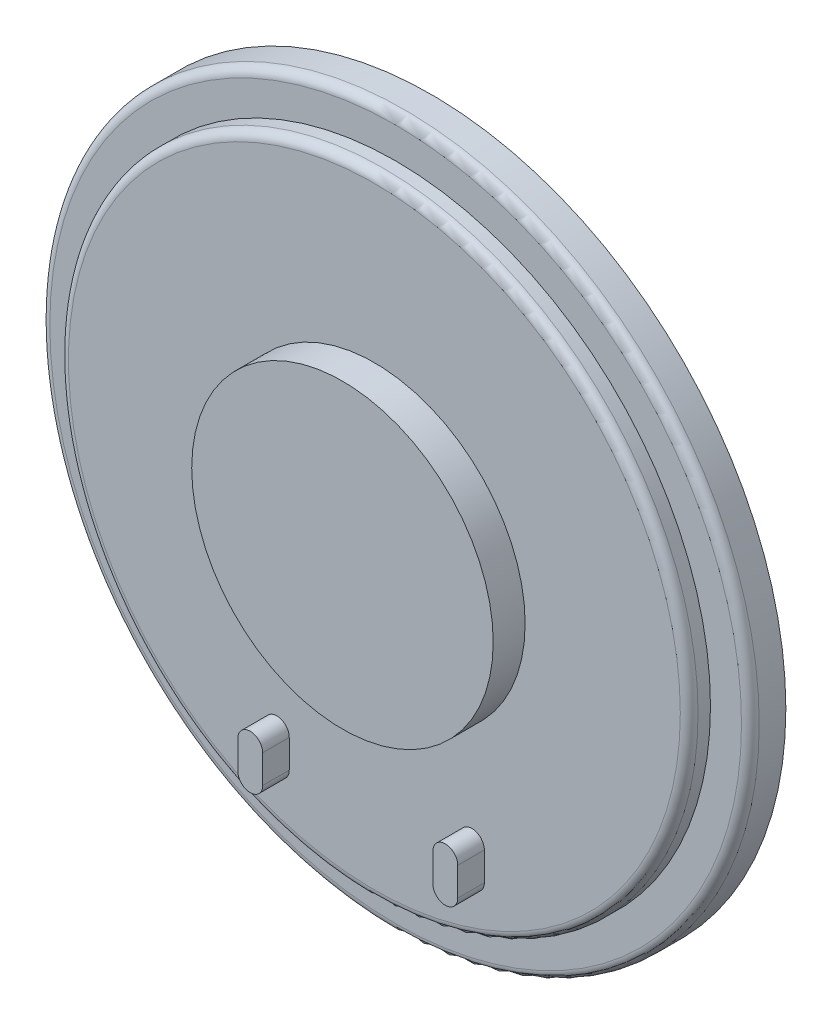
ISO-10303-21;
HEADER;
FILE_DESCRIPTION(('STEP AP214'),'2;1');
FILE_NAME('part.step','',(''),(''),'','','');
FILE_SCHEMA(('AUTOMOTIVE_DESIGN { 1 0 10303 214 1 1 1 1 }'));
ENDSEC;
DATA;
#1=APPLICATION_CONTEXT('core data for automotive mechanical design processes');
#2=APPLICATION_PROTOCOL_DEFINITION('international standard','automotive_design',2000,#1);
#3=PRODUCT_CONTEXT('',#1,'mechanical');
#4=PRODUCT('Part','Part','',(#3));
#5=PRODUCT_RELATED_PRODUCT_CATEGORY('part','',(#4));
#6=PRODUCT_DEFINITION_FORMATION('','',#4);
#7=PRODUCT_DEFINITION_CONTEXT('part definition',#1,'design');
#8=PRODUCT_DEFINITION('design','',#6,#7);
#9=PRODUCT_DEFINITION_SHAPE('','',#8);
#10=(LENGTH_UNIT() NAMED_UNIT(*) SI_UNIT(.MILLI.,.METRE.));
#11=(NAMED_UNIT(*) PLANE_ANGLE_UNIT() SI_UNIT($,.RADIAN.));
#12=(NAMED_UNIT(*) SI_UNIT($,.STERADIAN.) SOLID_ANGLE_UNIT());
#13=UNCERTAINTY_MEASURE_WITH_UNIT(LENGTH_MEASURE(1.E-05),#10,'distance_accuracy_value','');
#14=(GEOMETRIC_REPRESENTATION_CONTEXT(3) GLOBAL_UNCERTAINTY_ASSIGNED_CONTEXT((#13)) GLOBAL_UNIT_ASSIGNED_CONTEXT((#10,
#11,#12)) REPRESENTATION_CONTEXT('',''));
#15=CARTESIAN_POINT('',(0.,0.,0.));
#16=DIRECTION('',(0.,0.,1.));
#17=DIRECTION('',(1.,0.,0.));
#18=AXIS2_PLACEMENT_3D('',#15,#16,#17);
#19=CARTESIAN_POINT('',(0.,0.,3.2));
#20=DIRECTION('',(0.,0.,1.));
#21=DIRECTION('',(1.,0.,0.));
#22=AXIS2_PLACEMENT_3D('',#19,#20,#21);
#23=PLANE('',#22);
#24=DIRECTION('',(0.,-1.,0.));
#25=VECTOR('',#24,1.);
#26=CARTESIAN_POINT('',(-6.2,-12.2,3.2));
#27=LINE('',#26,#25);
#28=CARTESIAN_POINT('',(-6.2,-12.2,3.2));
#29=VERTEX_POINT('',#28);
#30=CARTESIAN_POINT('',(-6.2,-13.8,3.2));
#31=VERTEX_POINT('',#30);
#32=EDGE_CURVE('E133',#29,#31,#27,.T.);
#33=ORIENTED_EDGE('',*,*,#32,.F.);
#34=CARTESIAN_POINT('',(-5.5,-12.2,3.2));
#35=DIRECTION('',(0.,0.,1.));
#36=DIRECTION('',(1.,0.,0.));
#37=AXIS2_PLACEMENT_3D('',#34,#35,#36);
#38=CIRCLE('',#37,0.700000000000001);
#39=CARTESIAN_POINT('',(-4.8,-12.2,3.2));
#40=VERTEX_POINT('',#39);
#41=EDGE_CURVE('E130',#40,#29,#38,.T.);
#42=ORIENTED_EDGE('',*,*,#41,.F.);
#43=DIRECTION('',(0.,1.,0.));
#44=VECTOR('',#43,1.);
#45=CARTESIAN_POINT('',(-4.8,-12.2,3.2));
#46=LINE('',#45,#44);
#47=CARTESIAN_POINT('',(-4.8,-13.8,3.2));
#48=VERTEX_POINT('',#47);
#49=EDGE_CURVE('E142',#48,#40,#46,.T.);
#50=ORIENTED_EDGE('',*,*,#49,.F.);
#51=CARTESIAN_POINT('',(-5.5,-13.8,3.2));
#52=DIRECTION('',(0.,0.,1.));
#53=DIRECTION('',(1.,0.,0.));
#54=AXIS2_PLACEMENT_3D('',#51,#52,#53);
#55=CIRCLE('',#54,0.700000000000001);
#56=EDGE_CURVE('E150',#31,#48,#55,.T.);
#57=ORIENTED_EDGE('',*,*,#56,.F.);
#58=EDGE_LOOP('',(#33,#42,#50,#57));
#59=FACE_BOUND('',#58,.T.);
#60=CARTESIAN_POINT('',(0.,0.,3.2));
#61=DIRECTION('',(0.,0.,1.));
#62=DIRECTION('',(1.,0.,0.));
#63=AXIS2_PLACEMENT_3D('',#60,#61,#62);
#64=CIRCLE('',#63,17.25);
#65=CARTESIAN_POINT('',(17.25,0.,3.2));
#66=VERTEX_POINT('',#65);
#67=EDGE_CURVE('E13',#66,#66,#64,.T.);
#68=ORIENTED_EDGE('',*,*,#67,.T.);
#69=EDGE_LOOP('',(#68));
#70=FACE_BOUND('',#69,.T.);
#71=CARTESIAN_POINT('',(0.,0.,3.2));
#72=DIRECTION('',(0.,0.,1.));
#73=DIRECTION('',(1.,0.,0.));
#74=AXIS2_PLACEMENT_3D('',#71,#72,#73);
#75=CIRCLE('',#74,8.5);
#76=CARTESIAN_POINT('',(8.5,0.,3.2));
#77=VERTEX_POINT('',#76);
#78=EDGE_CURVE('E165',#77,#77,#75,.T.);
#79=ORIENTED_EDGE('',*,*,#78,.F.);
#80=EDGE_LOOP('',(#79));
#81=FACE_BOUND('',#80,.T.);
#82=DIRECTION('',(0.,-1.,0.));
#83=VECTOR('',#82,1.);
#84=CARTESIAN_POINT('',(4.8,-12.2,3.2));
#85=LINE('',#84,#83);
#86=CARTESIAN_POINT('',(4.8,-12.2,3.2));
#87=VERTEX_POINT('',#86);
#88=CARTESIAN_POINT('',(4.8,-13.8,3.2));
#89=VERTEX_POINT('',#88);
#90=EDGE_CURVE('E395',#87,#89,#85,.T.);
#91=ORIENTED_EDGE('',*,*,#90,.F.);
#92=CARTESIAN_POINT('',(5.5,-12.2,3.2));
#93=DIRECTION('',(0.,0.,1.));
#94=DIRECTION('',(-1.,0.,0.));
#95=AXIS2_PLACEMENT_3D('',#92,#93,#94);
#96=CIRCLE('',#95,0.700000000000001);
#97=CARTESIAN_POINT('',(6.2,-12.2,3.2));
#98=VERTEX_POINT('',#97);
#99=EDGE_CURVE('E128',#98,#87,#96,.T.);
#100=ORIENTED_EDGE('',*,*,#99,.F.);
#101=DIRECTION('',(0.,1.,0.));
#102=VECTOR('',#101,1.);
#103=CARTESIAN_POINT('',(6.2,-12.2,3.2));
#104=LINE('',#103,#102);
#105=CARTESIAN_POINT('',(6.2,-13.8,3.2));
#106=VERTEX_POINT('',#105);
#107=EDGE_CURVE('E124',#106,#98,#104,.T.);
#108=ORIENTED_EDGE('',*,*,#107,.F.);
#109=CARTESIAN_POINT('',(5.5,-13.8,3.2));
#110=DIRECTION('',(0.,0.,1.));
#111=DIRECTION('',(-1.,0.,0.));
#112=AXIS2_PLACEMENT_3D('',#109,#110,#111);
#113=CIRCLE('',#112,0.700000000000001);
#114=EDGE_CURVE('E397',#89,#106,#113,.T.);
#115=ORIENTED_EDGE('',*,*,#114,.F.);
#116=EDGE_LOOP('',(#91,#100,#108,#115));
#117=FACE_BOUND('',#116,.T.);
#118=ADVANCED_FACE('F39',(#59,#70,#81,#117),#23,.T.);
#119=CARTESIAN_POINT('',(0.,0.,-57.134227919873));
#120=DIRECTION('',(0.,0.,1.));
#121=DIRECTION('',(1.,0.,0.));
#122=AXIS2_PLACEMENT_3D('',#119,#120,#121);
#123=CYLINDRICAL_SURFACE('',#122,17.75);
#124=CARTESIAN_POINT('',(0.,0.,2.7));
#125=DIRECTION('',(0.,0.,1.));
#126=DIRECTION('',(1.,0.,0.));
#127=AXIS2_PLACEMENT_3D('',#124,#125,#126);
#128=CIRCLE('',#127,17.75);
#129=CARTESIAN_POINT('',(17.75,0.,2.7));
#130=VERTEX_POINT('',#129);
#131=EDGE_CURVE('E47',#130,#130,#128,.F.);
#132=ORIENTED_EDGE('',*,*,#131,.T.);
#133=EDGE_LOOP('',(#132));
#134=FACE_BOUND('',#133,.T.);
#135=CARTESIAN_POINT('',(0.,0.,2.));
#136=DIRECTION('',(0.,0.,1.));
#137=DIRECTION('',(1.,0.,0.));
#138=AXIS2_PLACEMENT_3D('',#135,#136,#137);
#139=CIRCLE('',#138,17.75);
#140=CARTESIAN_POINT('',(17.75,0.,2.));
#141=VERTEX_POINT('',#140);
#142=EDGE_CURVE('E168',#141,#141,#139,.F.);
#143=ORIENTED_EDGE('',*,*,#142,.F.);
#144=EDGE_LOOP('',(#143));
#145=FACE_BOUND('',#144,.T.);
#146=ADVANCED_FACE('F190',(#134,#145),#123,.T.);
#147=CARTESIAN_POINT('',(0.,0.,5.));
#148=DIRECTION('',(0.,0.,-1.));
#149=DIRECTION('',(-1.,0.,0.));
#150=AXIS2_PLACEMENT_3D('',#147,#148,#149);
#151=CYLINDRICAL_SURFACE('',#150,20.);
#152=CARTESIAN_POINT('',(0.,0.,1.5));
#153=DIRECTION('',(0.,0.,1.));
#154=DIRECTION('',(1.,0.,0.));
#155=AXIS2_PLACEMENT_3D('',#152,#153,#154);
#156=CIRCLE('',#155,20.);
#157=CARTESIAN_POINT('',(20.,0.,1.5));
#158=VERTEX_POINT('',#157);
#159=EDGE_CURVE('E185',#158,#158,#156,.F.);
#160=ORIENTED_EDGE('',*,*,#159,.T.);
#161=EDGE_LOOP('',(#160));
#162=FACE_BOUND('',#161,.T.);
#163=CARTESIAN_POINT('',(0.,0.,0.));
#164=DIRECTION('',(0.,0.,1.));
#165=DIRECTION('',(1.,0.,0.));
#166=AXIS2_PLACEMENT_3D('',#163,#164,#165);
#167=CIRCLE('',#166,20.);
#168=CARTESIAN_POINT('',(20.,0.,0.));
#169=VERTEX_POINT('',#168);
#170=EDGE_CURVE('E173',#169,#169,#167,.T.);
#171=ORIENTED_EDGE('',*,*,#170,.T.);
#172=EDGE_LOOP('',(#171));
#173=FACE_BOUND('',#172,.T.);
#174=ADVANCED_FACE('F213',(#162,#173),#151,.T.);
#175=CARTESIAN_POINT('',(0.,0.,0.));
#176=DIRECTION('',(0.,0.,1.));
#177=DIRECTION('',(1.,0.,0.));
#178=AXIS2_PLACEMENT_3D('',#175,#176,#177);
#179=PLANE('',#178);
#180=CARTESIAN_POINT('',(0.,0.,0.));
#181=DIRECTION('',(0.,0.,1.));
#182=DIRECTION('',(1.,0.,0.));
#183=AXIS2_PLACEMENT_3D('',#180,#181,#182);
#184=CIRCLE('',#183,19.25);
#185=CARTESIAN_POINT('',(19.25,0.,0.));
#186=VERTEX_POINT('',#185);
#187=EDGE_CURVE('E179',#186,#186,#184,.T.);
#188=ORIENTED_EDGE('',*,*,#187,.T.);
#189=EDGE_LOOP('',(#188));
#190=FACE_BOUND('',#189,.T.);
#191=ORIENTED_EDGE('',*,*,#170,.F.);
#192=EDGE_LOOP('',(#191));
#193=FACE_BOUND('',#192,.T.);
#194=ADVANCED_FACE('F223',(#190,#193),#179,.F.);
#195=CARTESIAN_POINT('',(0.,0.,2.));
#196=DIRECTION('',(0.,0.,1.));
#197=DIRECTION('',(1.,0.,0.));
#198=AXIS2_PLACEMENT_3D('',#195,#196,#197);
#199=PLANE('',#198);
#200=CARTESIAN_POINT('',(0.,0.,2.));
#201=DIRECTION('',(0.,0.,1.));
#202=DIRECTION('',(1.,0.,0.));
#203=AXIS2_PLACEMENT_3D('',#200,#201,#202);
#204=CIRCLE('',#203,19.5);
#205=CARTESIAN_POINT('',(19.5,0.,2.));
#206=VERTEX_POINT('',#205);
#207=EDGE_CURVE('E182',#206,#206,#204,.T.);
#208=ORIENTED_EDGE('',*,*,#207,.T.);
#209=EDGE_LOOP('',(#208));
#210=FACE_BOUND('',#209,.T.);
#211=ORIENTED_EDGE('',*,*,#142,.T.);
#212=EDGE_LOOP('',(#211));
#213=FACE_BOUND('',#212,.T.);
#214=ADVANCED_FACE('F221',(#210,#213),#199,.T.);
#215=CARTESIAN_POINT('',(0.,0.,3.2));
#216=DIRECTION('',(0.,0.,1.));
#217=DIRECTION('',(1.,0.,0.));
#218=AXIS2_PLACEMENT_3D('',#215,#216,#217);
#219=CYLINDRICAL_SURFACE('',#218,8.5);
#220=ORIENTED_EDGE('',*,*,#78,.T.);
#221=EDGE_LOOP('',(#220));
#222=FACE_BOUND('',#221,.T.);
#223=CARTESIAN_POINT('',(0.,0.,5.));
#224=DIRECTION('',(0.,0.,1.));
#225=DIRECTION('',(1.,0.,0.));
#226=AXIS2_PLACEMENT_3D('',#223,#224,#225);
#227=CIRCLE('',#226,8.5);
#228=CARTESIAN_POINT('',(8.5,0.,5.));
#229=VERTEX_POINT('',#228);
#230=EDGE_CURVE('E164',#229,#229,#227,.T.);
#231=ORIENTED_EDGE('',*,*,#230,.F.);
#232=EDGE_LOOP('',(#231));
#233=FACE_BOUND('',#232,.T.);
#234=ADVANCED_FACE('F219',(#222,#233),#219,.T.);
#235=CARTESIAN_POINT('',(0.,0.,5.));
#236=DIRECTION('',(0.,0.,1.));
#237=DIRECTION('',(1.,0.,0.));
#238=AXIS2_PLACEMENT_3D('',#235,#236,#237);
#239=PLANE('',#238);
#240=ORIENTED_EDGE('',*,*,#230,.T.);
#241=EDGE_LOOP('',(#240));
#242=FACE_BOUND('',#241,.T.);
#243=ADVANCED_FACE('F226',(#242),#239,.T.);
#244=CARTESIAN_POINT('',(0.,0.,1.8));
#245=DIRECTION('',(0.,0.,-1.));
#246=DIRECTION('',(-1.,0.,0.));
#247=AXIS2_PLACEMENT_3D('',#244,#245,#246);
#248=CYLINDRICAL_SURFACE('',#247,17.75);
#249=CARTESIAN_POINT('',(0.,0.,1.5));
#250=DIRECTION('',(0.,0.,1.));
#251=DIRECTION('',(1.,0.,0.));
#252=AXIS2_PLACEMENT_3D('',#249,#250,#251);
#253=CIRCLE('',#252,17.75);
#254=CARTESIAN_POINT('',(17.75,0.,1.5));
#255=VERTEX_POINT('',#254);
#256=EDGE_CURVE('E176',#255,#255,#253,.F.);
#257=ORIENTED_EDGE('',*,*,#256,.T.);
#258=EDGE_LOOP('',(#257));
#259=FACE_BOUND('',#258,.T.);
#260=CARTESIAN_POINT('',(0.,0.,1.8));
#261=DIRECTION('',(0.,0.,-1.));
#262=DIRECTION('',(-1.,0.,0.));
#263=AXIS2_PLACEMENT_3D('',#260,#261,#262);
#264=CIRCLE('',#263,17.75);
#265=CARTESIAN_POINT('',(-17.75,0.,1.8));
#266=VERTEX_POINT('',#265);
#267=EDGE_CURVE('E161',#266,#266,#264,.T.);
#268=ORIENTED_EDGE('',*,*,#267,.F.);
#269=EDGE_LOOP('',(#268));
#270=FACE_BOUND('',#269,.T.);
#271=ADVANCED_FACE('F229',(#259,#270),#248,.F.);
#272=CARTESIAN_POINT('',(0.,0.,1.8));
#273=DIRECTION('',(0.,0.,-1.));
#274=DIRECTION('',(-1.,0.,0.));
#275=AXIS2_PLACEMENT_3D('',#272,#273,#274);
#276=PLANE('',#275);
#277=ORIENTED_EDGE('',*,*,#267,.T.);
#278=EDGE_LOOP('',(#277));
#279=FACE_BOUND('',#278,.T.);
#280=ADVANCED_FACE('F238',(#279),#276,.T.);
#281=CARTESIAN_POINT('',(0.,0.,1.5));
#282=DIRECTION('',(0.,0.,1.));
#283=DIRECTION('',(1.,0.,0.));
#284=AXIS2_PLACEMENT_3D('',#281,#282,#283);
#285=TOROIDAL_SURFACE('',#284,19.25,1.5);
#286=ORIENTED_EDGE('',*,*,#187,.F.);
#287=EDGE_LOOP('',(#286));
#288=FACE_BOUND('',#287,.T.);
#289=ORIENTED_EDGE('',*,*,#256,.F.);
#290=EDGE_LOOP('',(#289));
#291=FACE_BOUND('',#290,.T.);
#292=ADVANCED_FACE('F204',(#288,#291),#285,.T.);
#293=CARTESIAN_POINT('',(0.,0.,1.5));
#294=DIRECTION('',(0.,0.,1.));
#295=DIRECTION('',(1.,0.,0.));
#296=AXIS2_PLACEMENT_3D('',#293,#294,#295);
#297=TOROIDAL_SURFACE('',#296,19.5,0.5);
#298=ORIENTED_EDGE('',*,*,#159,.F.);
#299=EDGE_LOOP('',(#298));
#300=FACE_BOUND('',#299,.T.);
#301=ORIENTED_EDGE('',*,*,#207,.F.);
#302=EDGE_LOOP('',(#301));
#303=FACE_BOUND('',#302,.T.);
#304=ADVANCED_FACE('F195',(#300,#303),#297,.T.);
#305=CARTESIAN_POINT('',(0.,0.,2.7));
#306=DIRECTION('',(0.,0.,1.));
#307=DIRECTION('',(1.,0.,0.));
#308=AXIS2_PLACEMENT_3D('',#305,#306,#307);
#309=TOROIDAL_SURFACE('',#308,17.25,0.5);
#310=ORIENTED_EDGE('',*,*,#67,.F.);
#311=EDGE_LOOP('',(#310));
#312=FACE_BOUND('',#311,.T.);
#313=ORIENTED_EDGE('',*,*,#131,.F.);
#314=EDGE_LOOP('',(#313));
#315=FACE_BOUND('',#314,.T.);
#316=ADVANCED_FACE('F41',(#312,#315),#309,.T.);
#317=CARTESIAN_POINT('',(-5.5,-12.2,4.7));
#318=DIRECTION('',(0.,0.,-1.));
#319=DIRECTION('',(-1.,0.,0.));
#320=AXIS2_PLACEMENT_3D('',#317,#318,#319);
#321=CYLINDRICAL_SURFACE('',#320,0.700000000000001);
#322=ORIENTED_EDGE('',*,*,#41,.T.);
#323=DIRECTION('',(0.,0.,-1.));
#324=VECTOR('',#323,1.);
#325=CARTESIAN_POINT('',(-6.2,-12.2,4.7));
#326=LINE('',#325,#324);
#327=CARTESIAN_POINT('',(-6.2,-12.2,4.7));
#328=VERTEX_POINT('',#327);
#329=EDGE_CURVE('E159',#328,#29,#326,.T.);
#330=ORIENTED_EDGE('',*,*,#329,.F.);
#331=CARTESIAN_POINT('',(-5.5,-12.2,4.7));
#332=DIRECTION('',(0.,0.,1.));
#333=DIRECTION('',(1.,0.,0.));
#334=AXIS2_PLACEMENT_3D('',#331,#332,#333);
#335=CIRCLE('',#334,0.700000000000001);
#336=CARTESIAN_POINT('',(-4.8,-12.2,4.7));
#337=VERTEX_POINT('',#336);
#338=EDGE_CURVE('E138',#337,#328,#335,.T.);
#339=ORIENTED_EDGE('',*,*,#338,.F.);
#340=DIRECTION('',(0.,0.,-1.));
#341=VECTOR('',#340,1.);
#342=CARTESIAN_POINT('',(-4.8,-12.2,4.7));
#343=LINE('',#342,#341);
#344=EDGE_CURVE('E147',#337,#40,#343,.T.);
#345=ORIENTED_EDGE('',*,*,#344,.T.);
#346=EDGE_LOOP('',(#322,#330,#339,#345));
#347=FACE_BOUND('',#346,.T.);
#348=ADVANCED_FACE('F194',(#347),#321,.T.);
#349=CARTESIAN_POINT('',(-6.2,-12.2,4.7));
#350=DIRECTION('',(1.,0.,0.));
#351=DIRECTION('',(0.,0.,-1.));
#352=AXIS2_PLACEMENT_3D('',#349,#350,#351);
#353=PLANE('',#352);
#354=ORIENTED_EDGE('',*,*,#32,.T.);
#355=DIRECTION('',(0.,0.,-1.));
#356=VECTOR('',#355,1.);
#357=CARTESIAN_POINT('',(-6.2,-13.8,4.7));
#358=LINE('',#357,#356);
#359=CARTESIAN_POINT('',(-6.2,-13.8,4.7));
#360=VERTEX_POINT('',#359);
#361=EDGE_CURVE('E156',#360,#31,#358,.T.);
#362=ORIENTED_EDGE('',*,*,#361,.F.);
#363=DIRECTION('',(0.,-1.,0.));
#364=VECTOR('',#363,1.);
#365=CARTESIAN_POINT('',(-6.2,-12.2,4.7));
#366=LINE('',#365,#364);
#367=EDGE_CURVE('E141',#328,#360,#366,.T.);
#368=ORIENTED_EDGE('',*,*,#367,.F.);
#369=ORIENTED_EDGE('',*,*,#329,.T.);
#370=EDGE_LOOP('',(#354,#362,#368,#369));
#371=FACE_BOUND('',#370,.T.);
#372=ADVANCED_FACE('F201',(#371),#353,.F.);
#373=CARTESIAN_POINT('',(-5.5,-13.8,4.7));
#374=DIRECTION('',(0.,0.,-1.));
#375=DIRECTION('',(-1.,0.,0.));
#376=AXIS2_PLACEMENT_3D('',#373,#374,#375);
#377=CYLINDRICAL_SURFACE('',#376,0.700000000000001);
#378=ORIENTED_EDGE('',*,*,#56,.T.);
#379=DIRECTION('',(0.,0.,-1.));
#380=VECTOR('',#379,1.);
#381=CARTESIAN_POINT('',(-4.8,-13.8,4.7));
#382=LINE('',#381,#380);
#383=CARTESIAN_POINT('',(-4.8,-13.8,4.7));
#384=VERTEX_POINT('',#383);
#385=EDGE_CURVE('E62',#384,#48,#382,.T.);
#386=ORIENTED_EDGE('',*,*,#385,.F.);
#387=CARTESIAN_POINT('',(-5.5,-13.8,4.7));
#388=DIRECTION('',(0.,0.,1.));
#389=DIRECTION('',(1.,0.,0.));
#390=AXIS2_PLACEMENT_3D('',#387,#388,#389);
#391=CIRCLE('',#390,0.700000000000001);
#392=EDGE_CURVE('E144',#360,#384,#391,.T.);
#393=ORIENTED_EDGE('',*,*,#392,.F.);
#394=ORIENTED_EDGE('',*,*,#361,.T.);
#395=EDGE_LOOP('',(#378,#386,#393,#394));
#396=FACE_BOUND('',#395,.T.);
#397=ADVANCED_FACE('F257',(#396),#377,.T.);
#398=CARTESIAN_POINT('',(-4.8,-12.2,4.7));
#399=DIRECTION('',(-1.,0.,0.));
#400=DIRECTION('',(0.,0.,1.));
#401=AXIS2_PLACEMENT_3D('',#398,#399,#400);
#402=PLANE('',#401);
#403=ORIENTED_EDGE('',*,*,#49,.T.);
#404=ORIENTED_EDGE('',*,*,#344,.F.);
#405=DIRECTION('',(0.,1.,0.));
#406=VECTOR('',#405,1.);
#407=CARTESIAN_POINT('',(-4.8,-12.2,4.7));
#408=LINE('',#407,#406);
#409=EDGE_CURVE('E146',#384,#337,#408,.T.);
#410=ORIENTED_EDGE('',*,*,#409,.F.);
#411=ORIENTED_EDGE('',*,*,#385,.T.);
#412=EDGE_LOOP('',(#403,#404,#410,#411));
#413=FACE_BOUND('',#412,.T.);
#414=ADVANCED_FACE('F261',(#413),#402,.F.);
#415=CARTESIAN_POINT('',(-5.5,-12.2,4.7));
#416=DIRECTION('',(0.,0.,1.));
#417=DIRECTION('',(1.,0.,0.));
#418=AXIS2_PLACEMENT_3D('',#415,#416,#417);
#419=PLANE('',#418);
#420=ORIENTED_EDGE('',*,*,#338,.T.);
#421=ORIENTED_EDGE('',*,*,#367,.T.);
#422=ORIENTED_EDGE('',*,*,#392,.T.);
#423=ORIENTED_EDGE('',*,*,#409,.T.);
#424=EDGE_LOOP('',(#420,#421,#422,#423));
#425=FACE_BOUND('',#424,.T.);
#426=ADVANCED_FACE('F265',(#425),#419,.T.);
#427=CARTESIAN_POINT('',(5.5,-12.2,4.7));
#428=DIRECTION('',(0.,0.,-1.));
#429=DIRECTION('',(-1.,0.,0.));
#430=AXIS2_PLACEMENT_3D('',#427,#428,#429);
#431=CYLINDRICAL_SURFACE('',#430,0.700000000000001);
#432=ORIENTED_EDGE('',*,*,#99,.T.);
#433=DIRECTION('',(0.,0.,-1.));
#434=VECTOR('',#433,1.);
#435=CARTESIAN_POINT('',(4.8,-12.2,4.7));
#436=LINE('',#435,#434);
#437=CARTESIAN_POINT('',(4.8,-12.2,4.7));
#438=VERTEX_POINT('',#437);
#439=EDGE_CURVE('E109',#438,#87,#436,.T.);
#440=ORIENTED_EDGE('',*,*,#439,.F.);
#441=CARTESIAN_POINT('',(5.5,-12.2,4.7));
#442=DIRECTION('',(0.,0.,1.));
#443=DIRECTION('',(-1.,0.,0.));
#444=AXIS2_PLACEMENT_3D('',#441,#442,#443);
#445=CIRCLE('',#444,0.700000000000001);
#446=CARTESIAN_POINT('',(6.2,-12.2,4.7));
#447=VERTEX_POINT('',#446);
#448=EDGE_CURVE('E116',#447,#438,#445,.T.);
#449=ORIENTED_EDGE('',*,*,#448,.F.);
#450=DIRECTION('',(0.,0.,-1.));
#451=VECTOR('',#450,1.);
#452=CARTESIAN_POINT('',(6.2,-12.2,4.7));
#453=LINE('',#452,#451);
#454=EDGE_CURVE('E404',#447,#98,#453,.T.);
#455=ORIENTED_EDGE('',*,*,#454,.T.);
#456=EDGE_LOOP('',(#432,#440,#449,#455));
#457=FACE_BOUND('',#456,.T.);
#458=ADVANCED_FACE('F126',(#457),#431,.T.);
#459=CARTESIAN_POINT('',(4.8,-12.2,4.7));
#460=DIRECTION('',(1.,0.,0.));
#461=DIRECTION('',(0.,0.,-1.));
#462=AXIS2_PLACEMENT_3D('',#459,#460,#461);
#463=PLANE('',#462);
#464=ORIENTED_EDGE('',*,*,#90,.T.);
#465=DIRECTION('',(0.,0.,-1.));
#466=VECTOR('',#465,1.);
#467=CARTESIAN_POINT('',(4.8,-13.8,4.7));
#468=LINE('',#467,#466);
#469=CARTESIAN_POINT('',(4.8,-13.8,4.7));
#470=VERTEX_POINT('',#469);
#471=EDGE_CURVE('E112',#470,#89,#468,.T.);
#472=ORIENTED_EDGE('',*,*,#471,.F.);
#473=DIRECTION('',(0.,-1.,0.));
#474=VECTOR('',#473,1.);
#475=CARTESIAN_POINT('',(4.8,-12.2,4.7));
#476=LINE('',#475,#474);
#477=EDGE_CURVE('E105',#438,#470,#476,.T.);
#478=ORIENTED_EDGE('',*,*,#477,.F.);
#479=ORIENTED_EDGE('',*,*,#439,.T.);
#480=EDGE_LOOP('',(#464,#472,#478,#479));
#481=FACE_BOUND('',#480,.T.);
#482=ADVANCED_FACE('F107',(#481),#463,.F.);
#483=CARTESIAN_POINT('',(5.5,-13.8,4.7));
#484=DIRECTION('',(0.,0.,-1.));
#485=DIRECTION('',(-1.,0.,0.));
#486=AXIS2_PLACEMENT_3D('',#483,#484,#485);
#487=CYLINDRICAL_SURFACE('',#486,0.700000000000001);
#488=ORIENTED_EDGE('',*,*,#114,.T.);
#489=DIRECTION('',(0.,0.,-1.));
#490=VECTOR('',#489,1.);
#491=CARTESIAN_POINT('',(6.2,-13.8,4.7));
#492=LINE('',#491,#490);
#493=CARTESIAN_POINT('',(6.2,-13.8,4.7));
#494=VERTEX_POINT('',#493);
#495=EDGE_CURVE('E54',#494,#106,#492,.T.);
#496=ORIENTED_EDGE('',*,*,#495,.F.);
#497=CARTESIAN_POINT('',(5.5,-13.8,4.7));
#498=DIRECTION('',(0.,0.,1.));
#499=DIRECTION('',(-1.,0.,0.));
#500=AXIS2_PLACEMENT_3D('',#497,#498,#499);
#501=CIRCLE('',#500,0.700000000000001);
#502=EDGE_CURVE('E115',#470,#494,#501,.T.);
#503=ORIENTED_EDGE('',*,*,#502,.F.);
#504=ORIENTED_EDGE('',*,*,#471,.T.);
#505=EDGE_LOOP('',(#488,#496,#503,#504));
#506=FACE_BOUND('',#505,.T.);
#507=ADVANCED_FACE('F273',(#506),#487,.T.);
#508=CARTESIAN_POINT('',(6.2,-12.2,4.7));
#509=DIRECTION('',(-1.,0.,0.));
#510=DIRECTION('',(0.,0.,1.));
#511=AXIS2_PLACEMENT_3D('',#508,#509,#510);
#512=PLANE('',#511);
#513=ORIENTED_EDGE('',*,*,#107,.T.);
#514=ORIENTED_EDGE('',*,*,#454,.F.);
#515=DIRECTION('',(0.,1.,0.));
#516=VECTOR('',#515,1.);
#517=CARTESIAN_POINT('',(6.2,-12.2,4.7));
#518=LINE('',#517,#516);
#519=EDGE_CURVE('E120',#494,#447,#518,.T.);
#520=ORIENTED_EDGE('',*,*,#519,.F.);
#521=ORIENTED_EDGE('',*,*,#495,.T.);
#522=EDGE_LOOP('',(#513,#514,#520,#521));
#523=FACE_BOUND('',#522,.T.);
#524=ADVANCED_FACE('F276',(#523),#512,.F.);
#525=CARTESIAN_POINT('',(5.5,-12.2,4.7));
#526=DIRECTION('',(0.,0.,-1.));
#527=DIRECTION('',(-1.,0.,0.));
#528=AXIS2_PLACEMENT_3D('',#525,#526,#527);
#529=PLANE('',#528);
#530=ORIENTED_EDGE('',*,*,#448,.T.);
#531=ORIENTED_EDGE('',*,*,#477,.T.);
#532=ORIENTED_EDGE('',*,*,#502,.T.);
#533=ORIENTED_EDGE('',*,*,#519,.T.);
#534=EDGE_LOOP('',(#530,#531,#532,#533));
#535=FACE_BOUND('',#534,.T.);
#536=ADVANCED_FACE('F119',(#535),#529,.F.);
#537=CLOSED_SHELL('',(#118,#146,#174,#194,#214,#234,#243,#271,#280,#292,#304,#316,#348,#372,
#397,#414,#426,#458,#482,#507,#524,#536));
#538=MANIFOLD_SOLID_BREP('B2',#537);
#539=ADVANCED_BREP_SHAPE_REPRESENTATION('',(#18,#538),#14);
#540=SHAPE_DEFINITION_REPRESENTATION(#9,#539);
ENDSEC;
END-ISO-10303-21;
